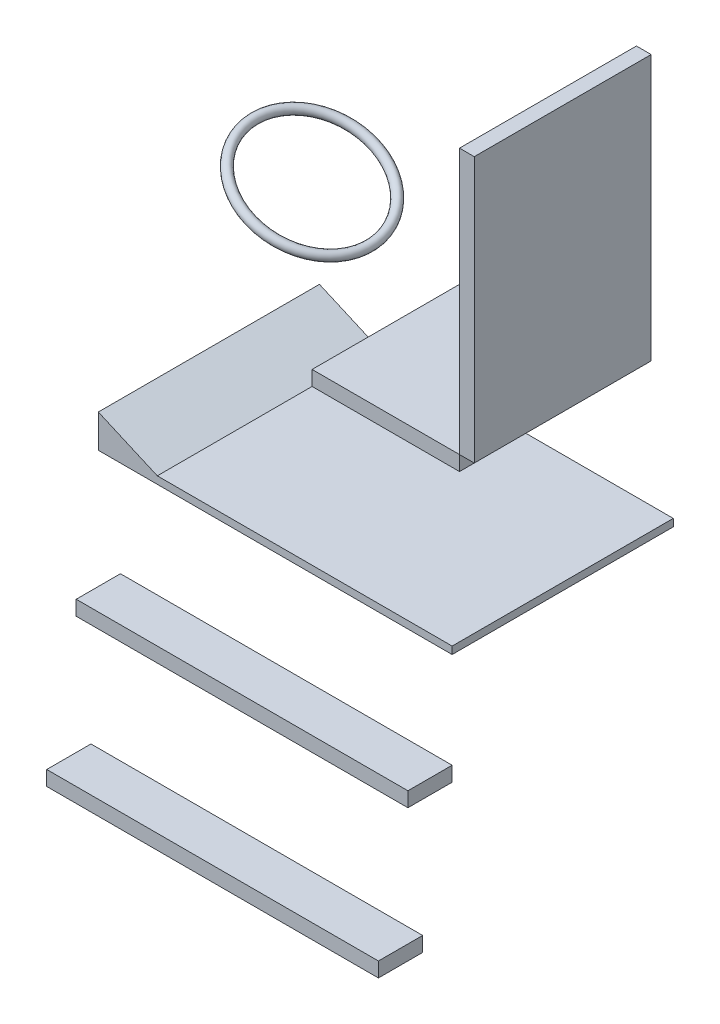
ISO-10303-21;
HEADER;
FILE_DESCRIPTION(('STEP AP214'),'2;1');
FILE_NAME('part.step','',(''),(''),'','','');
FILE_SCHEMA(('AUTOMOTIVE_DESIGN { 1 0 10303 214 1 1 1 1 }'));
ENDSEC;
DATA;
#1=APPLICATION_CONTEXT('core data for automotive mechanical design processes');
#2=APPLICATION_PROTOCOL_DEFINITION('international standard','automotive_design',2000,#1);
#3=PRODUCT_CONTEXT('',#1,'mechanical');
#4=PRODUCT('Part','Part','',(#3));
#5=PRODUCT_RELATED_PRODUCT_CATEGORY('part','',(#4));
#6=PRODUCT_DEFINITION_FORMATION('','',#4);
#7=PRODUCT_DEFINITION_CONTEXT('part definition',#1,'design');
#8=PRODUCT_DEFINITION('design','',#6,#7);
#9=PRODUCT_DEFINITION_SHAPE('','',#8);
#10=(LENGTH_UNIT() NAMED_UNIT(*) SI_UNIT(.MILLI.,.METRE.));
#11=(NAMED_UNIT(*) PLANE_ANGLE_UNIT() SI_UNIT($,.RADIAN.));
#12=(NAMED_UNIT(*) SI_UNIT($,.STERADIAN.) SOLID_ANGLE_UNIT());
#13=UNCERTAINTY_MEASURE_WITH_UNIT(LENGTH_MEASURE(1.E-05),#10,'distance_accuracy_value','');
#14=(GEOMETRIC_REPRESENTATION_CONTEXT(3) GLOBAL_UNCERTAINTY_ASSIGNED_CONTEXT((#13)) GLOBAL_UNIT_ASSIGNED_CONTEXT((#10,
#11,#12)) REPRESENTATION_CONTEXT('',''));
#15=CARTESIAN_POINT('',(0.,0.,0.));
#16=DIRECTION('',(0.,0.,1.));
#17=DIRECTION('',(1.,0.,0.));
#18=AXIS2_PLACEMENT_3D('',#15,#16,#17);
#19=CARTESIAN_POINT('',(355.375295826059,2032.10478127713,-381.));
#20=DIRECTION('',(-0.422618261740694,-0.906307787036653,0.));
#21=DIRECTION('',(0.906307787036653,-0.422618261740694,0.));
#22=AXIS2_PLACEMENT_3D('',#19,#20,#21);
#23=TOROIDAL_SURFACE('',#22,217.4875,15.875);
#24=CARTESIAN_POINT('',(158.264680992925,2124.01897047746,-381.));
#25=DIRECTION('',(0.,0.,1.));
#26=DIRECTION('',(1.,0.,0.));
#27=AXIS2_PLACEMENT_3D('',#24,#25,#26);
#28=CIRCLE('',#27,15.875);
#29=CARTESIAN_POINT('',(143.877044873718,2130.72803538259,-381.));
#30=VERTEX_POINT('',#29);
#31=EDGE_CURVE('E11',#30,#30,#28,.T.);
#32=CARTESIAN_POINT('',(355.375295826059,2032.10478127713,-381.));
#33=DIRECTION('',(-0.422618261740694,-0.906307787036653,0.));
#34=DIRECTION('',(0.906307787036653,-0.422618261740694,0.));
#35=AXIS2_PLACEMENT_3D('',#32,#33,#34);
#36=CIRCLE('',#35,233.3625);
#37=EDGE_CURVE('',#30,#30,#36,.T.);
#38=ORIENTED_EDGE('',*,*,#31,.F.);
#39=ORIENTED_EDGE('',*,*,#31,.T.);
#40=ORIENTED_EDGE('',*,*,#37,.T.);
#41=ORIENTED_EDGE('',*,*,#37,.F.);
#42=EDGE_LOOP('',(#38,#40,#39,#41));
#43=FACE_BOUND('',#42,.T.);
#44=ADVANCED_FACE('F54',(#43),#23,.T.);
#45=CLOSED_SHELL('',(#44));
#46=MANIFOLD_SOLID_BREP('B2',#45);
#47=CARTESIAN_POINT('',(0.,1244.6,0.));
#48=DIRECTION('',(1.,0.,0.));
#49=DIRECTION('',(0.,0.,-1.));
#50=AXIS2_PLACEMENT_3D('',#47,#48,#49);
#51=PLANE('',#50);
#52=DIRECTION('',(0.,0.,-1.));
#53=VECTOR('',#52,1.);
#54=CARTESIAN_POINT('',(0.,1358.9,0.));
#55=LINE('',#54,#53);
#56=CARTESIAN_POINT('',(0.,1358.9,0.));
#57=VERTEX_POINT('',#56);
#58=CARTESIAN_POINT('',(0.,1358.9,-762.));
#59=VERTEX_POINT('',#58);
#60=EDGE_CURVE('E147',#57,#59,#55,.T.);
#61=ORIENTED_EDGE('',*,*,#60,.T.);
#62=DIRECTION('',(0.,-1.,0.));
#63=VECTOR('',#62,1.);
#64=CARTESIAN_POINT('',(0.,1244.6,-762.));
#65=LINE('',#64,#63);
#66=CARTESIAN_POINT('',(0.,1244.6,-762.));
#67=VERTEX_POINT('',#66);
#68=EDGE_CURVE('E140',#59,#67,#65,.T.);
#69=ORIENTED_EDGE('',*,*,#68,.T.);
#70=DIRECTION('',(0.,0.,-1.));
#71=VECTOR('',#70,1.);
#72=CARTESIAN_POINT('',(0.,1244.6,0.));
#73=LINE('',#72,#71);
#74=CARTESIAN_POINT('',(0.,1244.6,0.));
#75=VERTEX_POINT('',#74);
#76=EDGE_CURVE('E52',#75,#67,#73,.T.);
#77=ORIENTED_EDGE('',*,*,#76,.F.);
#78=DIRECTION('',(0.,-1.,0.));
#79=VECTOR('',#78,1.);
#80=CARTESIAN_POINT('',(0.,1244.6,0.));
#81=LINE('',#80,#79);
#82=EDGE_CURVE('E160',#57,#75,#81,.T.);
#83=ORIENTED_EDGE('',*,*,#82,.F.);
#84=EDGE_LOOP('',(#61,#69,#77,#83));
#85=FACE_BOUND('',#84,.T.);
#86=ADVANCED_FACE('F81',(#85),#51,.F.);
#87=CARTESIAN_POINT('',(1219.2,1244.6,0.));
#88=DIRECTION('',(0.,1.,0.));
#89=DIRECTION('',(-1.,0.,0.));
#90=AXIS2_PLACEMENT_3D('',#87,#88,#89);
#91=PLANE('',#90);
#92=ORIENTED_EDGE('',*,*,#76,.T.);
#93=DIRECTION('',(1.,0.,0.));
#94=VECTOR('',#93,1.);
#95=CARTESIAN_POINT('',(1219.2,1244.6,-762.));
#96=LINE('',#95,#94);
#97=CARTESIAN_POINT('',(1219.2,1244.6,-762.));
#98=VERTEX_POINT('',#97);
#99=EDGE_CURVE('E130',#67,#98,#96,.T.);
#100=ORIENTED_EDGE('',*,*,#99,.T.);
#101=DIRECTION('',(0.,0.,-1.));
#102=VECTOR('',#101,1.);
#103=CARTESIAN_POINT('',(1219.2,1244.6,0.));
#104=LINE('',#103,#102);
#105=CARTESIAN_POINT('',(1219.2,1244.6,0.));
#106=VERTEX_POINT('',#105);
#107=EDGE_CURVE('E89',#106,#98,#104,.T.);
#108=ORIENTED_EDGE('',*,*,#107,.F.);
#109=DIRECTION('',(1.,0.,0.));
#110=VECTOR('',#109,1.);
#111=CARTESIAN_POINT('',(1219.2,1244.6,0.));
#112=LINE('',#111,#110);
#113=EDGE_CURVE('E131',#75,#106,#112,.T.);
#114=ORIENTED_EDGE('',*,*,#113,.F.);
#115=EDGE_LOOP('',(#92,#100,#108,#114));
#116=FACE_BOUND('',#115,.T.);
#117=ADVANCED_FACE('F128',(#116),#91,.F.);
#118=CARTESIAN_POINT('',(1219.2,1270.,0.));
#119=DIRECTION('',(-1.,0.,0.));
#120=DIRECTION('',(0.,0.,1.));
#121=AXIS2_PLACEMENT_3D('',#118,#119,#120);
#122=PLANE('',#121);
#123=ORIENTED_EDGE('',*,*,#107,.T.);
#124=DIRECTION('',(0.,1.,0.));
#125=VECTOR('',#124,1.);
#126=CARTESIAN_POINT('',(1219.2,1270.,-762.));
#127=LINE('',#126,#125);
#128=CARTESIAN_POINT('',(1219.2,1270.,-762.));
#129=VERTEX_POINT('',#128);
#130=EDGE_CURVE('E144',#98,#129,#127,.T.);
#131=ORIENTED_EDGE('',*,*,#130,.T.);
#132=DIRECTION('',(0.,0.,-1.));
#133=VECTOR('',#132,1.);
#134=CARTESIAN_POINT('',(1219.2,1270.,0.));
#135=LINE('',#134,#133);
#136=CARTESIAN_POINT('',(1219.2,1270.,0.));
#137=VERTEX_POINT('',#136);
#138=EDGE_CURVE('E177',#137,#129,#135,.T.);
#139=ORIENTED_EDGE('',*,*,#138,.F.);
#140=DIRECTION('',(0.,1.,0.));
#141=VECTOR('',#140,1.);
#142=CARTESIAN_POINT('',(1219.2,1270.,0.));
#143=LINE('',#142,#141);
#144=EDGE_CURVE('E165',#106,#137,#143,.T.);
#145=ORIENTED_EDGE('',*,*,#144,.F.);
#146=EDGE_LOOP('',(#123,#131,#139,#145));
#147=FACE_BOUND('',#146,.T.);
#148=ADVANCED_FACE('F182',(#147),#122,.F.);
#149=CARTESIAN_POINT('',(203.2,1270.,0.));
#150=DIRECTION('',(0.,-1.,0.));
#151=DIRECTION('',(0.,0.,-1.));
#152=AXIS2_PLACEMENT_3D('',#149,#150,#151);
#153=PLANE('',#152);
#154=ORIENTED_EDGE('',*,*,#138,.T.);
#155=DIRECTION('',(-1.,0.,0.));
#156=VECTOR('',#155,1.);
#157=CARTESIAN_POINT('',(203.2,1270.,-762.));
#158=LINE('',#157,#156);
#159=CARTESIAN_POINT('',(203.2,1270.,-762.));
#160=VERTEX_POINT('',#159);
#161=EDGE_CURVE('E153',#129,#160,#158,.T.);
#162=ORIENTED_EDGE('',*,*,#161,.T.);
#163=DIRECTION('',(0.,0.,-1.));
#164=VECTOR('',#163,1.);
#165=CARTESIAN_POINT('',(203.2,1270.,0.));
#166=LINE('',#165,#164);
#167=CARTESIAN_POINT('',(203.2,1270.,0.));
#168=VERTEX_POINT('',#167);
#169=EDGE_CURVE('E174',#168,#160,#166,.T.);
#170=ORIENTED_EDGE('',*,*,#169,.F.);
#171=DIRECTION('',(-1.,0.,0.));
#172=VECTOR('',#171,1.);
#173=CARTESIAN_POINT('',(203.2,1270.,0.));
#174=LINE('',#173,#172);
#175=EDGE_CURVE('E101',#137,#168,#174,.T.);
#176=ORIENTED_EDGE('',*,*,#175,.F.);
#177=EDGE_LOOP('',(#154,#162,#170,#176));
#178=FACE_BOUND('',#177,.T.);
#179=ADVANCED_FACE('F193',(#178),#153,.F.);
#180=CARTESIAN_POINT('',(0.,1358.9,0.));
#181=DIRECTION('',(-0.400818834019708,-0.916157334902189,0.));
#182=DIRECTION('',(0.916157334902189,-0.400818834019708,0.));
#183=AXIS2_PLACEMENT_3D('',#180,#181,#182);
#184=PLANE('',#183);
#185=ORIENTED_EDGE('',*,*,#169,.T.);
#186=DIRECTION('',(-0.916157334902189,0.400818834019708,0.));
#187=VECTOR('',#186,1.);
#188=CARTESIAN_POINT('',(0.,1358.9,-762.));
#189=LINE('',#188,#187);
#190=EDGE_CURVE('E157',#160,#59,#189,.T.);
#191=ORIENTED_EDGE('',*,*,#190,.T.);
#192=ORIENTED_EDGE('',*,*,#60,.F.);
#193=DIRECTION('',(-0.916157334902189,0.400818834019708,0.));
#194=VECTOR('',#193,1.);
#195=CARTESIAN_POINT('',(0.,1358.9,0.));
#196=LINE('',#195,#194);
#197=EDGE_CURVE('E96',#168,#57,#196,.T.);
#198=ORIENTED_EDGE('',*,*,#197,.F.);
#199=EDGE_LOOP('',(#185,#191,#192,#198));
#200=FACE_BOUND('',#199,.T.);
#201=ADVANCED_FACE('F186',(#200),#184,.F.);
#202=CARTESIAN_POINT('',(0.,0.,0.));
#203=DIRECTION('',(0.,0.,-1.));
#204=DIRECTION('',(-1.,0.,0.));
#205=AXIS2_PLACEMENT_3D('',#202,#203,#204);
#206=PLANE('',#205);
#207=ORIENTED_EDGE('',*,*,#82,.T.);
#208=ORIENTED_EDGE('',*,*,#113,.T.);
#209=ORIENTED_EDGE('',*,*,#144,.T.);
#210=ORIENTED_EDGE('',*,*,#175,.T.);
#211=ORIENTED_EDGE('',*,*,#197,.T.);
#212=EDGE_LOOP('',(#207,#208,#209,#210,#211));
#213=FACE_BOUND('',#212,.T.);
#214=ADVANCED_FACE('F184',(#213),#206,.F.);
#215=CARTESIAN_POINT('',(0.,0.,-762.));
#216=DIRECTION('',(0.,0.,-1.));
#217=DIRECTION('',(-1.,0.,0.));
#218=AXIS2_PLACEMENT_3D('',#215,#216,#217);
#219=PLANE('',#218);
#220=ORIENTED_EDGE('',*,*,#68,.F.);
#221=ORIENTED_EDGE('',*,*,#190,.F.);
#222=ORIENTED_EDGE('',*,*,#161,.F.);
#223=ORIENTED_EDGE('',*,*,#130,.F.);
#224=ORIENTED_EDGE('',*,*,#99,.F.);
#225=EDGE_LOOP('',(#220,#221,#222,#223,#224));
#226=FACE_BOUND('',#225,.T.);
#227=ADVANCED_FACE('F138',(#226),#219,.T.);
#228=CLOSED_SHELL('',(#86,#117,#148,#179,#201,#214,#227));
#229=MANIFOLD_SOLID_BREP('B6',#228);
#230=CARTESIAN_POINT('',(1219.2,2692.4,-76.2));
#231=DIRECTION('',(0.,-1.,0.));
#232=DIRECTION('',(0.,0.,-1.));
#233=AXIS2_PLACEMENT_3D('',#230,#231,#232);
#234=PLANE('',#233);
#235=DIRECTION('',(0.,0.,-1.));
#236=VECTOR('',#235,1.);
#237=CARTESIAN_POINT('',(1219.2,2692.4,-76.2));
#238=LINE('',#237,#236);
#239=CARTESIAN_POINT('',(1219.2,2692.4,-76.2));
#240=VERTEX_POINT('',#239);
#241=CARTESIAN_POINT('',(1219.2,2692.4,-685.8));
#242=VERTEX_POINT('',#241);
#243=EDGE_CURVE('E313',#240,#242,#238,.T.);
#244=ORIENTED_EDGE('',*,*,#243,.T.);
#245=DIRECTION('',(-1.,0.,0.));
#246=VECTOR('',#245,1.);
#247=CARTESIAN_POINT('',(1219.2,2692.4,-685.8));
#248=LINE('',#247,#246);
#249=CARTESIAN_POINT('',(1168.4,2692.4,-685.8));
#250=VERTEX_POINT('',#249);
#251=EDGE_CURVE('E308',#242,#250,#248,.T.);
#252=ORIENTED_EDGE('',*,*,#251,.T.);
#253=DIRECTION('',(0.,0.,-1.));
#254=VECTOR('',#253,1.);
#255=CARTESIAN_POINT('',(1168.4,2692.4,-76.2));
#256=LINE('',#255,#254);
#257=CARTESIAN_POINT('',(1168.4,2692.4,-76.2));
#258=VERTEX_POINT('',#257);
#259=EDGE_CURVE('E79',#258,#250,#256,.T.);
#260=ORIENTED_EDGE('',*,*,#259,.F.);
#261=DIRECTION('',(-1.,0.,0.));
#262=VECTOR('',#261,1.);
#263=CARTESIAN_POINT('',(1219.2,2692.4,-76.2));
#264=LINE('',#263,#262);
#265=EDGE_CURVE('E319',#240,#258,#264,.T.);
#266=ORIENTED_EDGE('',*,*,#265,.F.);
#267=EDGE_LOOP('',(#244,#252,#260,#266));
#268=FACE_BOUND('',#267,.T.);
#269=ADVANCED_FACE('F256',(#268),#234,.F.);
#270=CARTESIAN_POINT('',(1168.4,1778.,-76.2));
#271=DIRECTION('',(1.,0.,0.));
#272=DIRECTION('',(0.,0.,-1.));
#273=AXIS2_PLACEMENT_3D('',#270,#271,#272);
#274=PLANE('',#273);
#275=ORIENTED_EDGE('',*,*,#259,.T.);
#276=DIRECTION('',(0.,-1.,0.));
#277=VECTOR('',#276,1.);
#278=CARTESIAN_POINT('',(1168.4,1778.,-685.8));
#279=LINE('',#278,#277);
#280=CARTESIAN_POINT('',(1168.4,1778.,-685.8));
#281=VERTEX_POINT('',#280);
#282=EDGE_CURVE('E298',#250,#281,#279,.T.);
#283=ORIENTED_EDGE('',*,*,#282,.T.);
#284=DIRECTION('',(0.,0.,-1.));
#285=VECTOR('',#284,1.);
#286=CARTESIAN_POINT('',(1168.4,1778.,-76.2));
#287=LINE('',#286,#285);
#288=CARTESIAN_POINT('',(1168.4,1778.,-76.2));
#289=VERTEX_POINT('',#288);
#290=EDGE_CURVE('E263',#289,#281,#287,.T.);
#291=ORIENTED_EDGE('',*,*,#290,.F.);
#292=DIRECTION('',(0.,-1.,0.));
#293=VECTOR('',#292,1.);
#294=CARTESIAN_POINT('',(1168.4,1778.,-76.2));
#295=LINE('',#294,#293);
#296=EDGE_CURVE('E299',#258,#289,#295,.T.);
#297=ORIENTED_EDGE('',*,*,#296,.F.);
#298=EDGE_LOOP('',(#275,#283,#291,#297));
#299=FACE_BOUND('',#298,.T.);
#300=ADVANCED_FACE('F296',(#299),#274,.F.);
#301=CARTESIAN_POINT('',(1168.4,1778.,-76.2));
#302=DIRECTION('',(0.,1.,0.));
#303=DIRECTION('',(0.,0.,1.));
#304=AXIS2_PLACEMENT_3D('',#301,#302,#303);
#305=PLANE('',#304);
#306=ORIENTED_EDGE('',*,*,#290,.T.);
#307=DIRECTION('',(1.,0.,0.));
#308=VECTOR('',#307,1.);
#309=CARTESIAN_POINT('',(1168.4,1778.,-685.8));
#310=LINE('',#309,#308);
#311=CARTESIAN_POINT('',(1219.2,1778.,-685.8));
#312=VERTEX_POINT('',#311);
#313=EDGE_CURVE('E311',#281,#312,#310,.T.);
#314=ORIENTED_EDGE('',*,*,#313,.T.);
#315=DIRECTION('',(0.,0.,-1.));
#316=VECTOR('',#315,1.);
#317=CARTESIAN_POINT('',(1219.2,1778.,-76.2));
#318=LINE('',#317,#316);
#319=CARTESIAN_POINT('',(1219.2,1778.,-76.2));
#320=VERTEX_POINT('',#319);
#321=EDGE_CURVE('E325',#320,#312,#318,.T.);
#322=ORIENTED_EDGE('',*,*,#321,.F.);
#323=DIRECTION('',(1.,0.,0.));
#324=VECTOR('',#323,1.);
#325=CARTESIAN_POINT('',(1168.4,1778.,-76.2));
#326=LINE('',#325,#324);
#327=EDGE_CURVE('E275',#289,#320,#326,.T.);
#328=ORIENTED_EDGE('',*,*,#327,.F.);
#329=EDGE_LOOP('',(#306,#314,#322,#328));
#330=FACE_BOUND('',#329,.T.);
#331=ADVANCED_FACE('F327',(#330),#305,.F.);
#332=CARTESIAN_POINT('',(1219.2,1778.,-76.2));
#333=DIRECTION('',(-1.,0.,0.));
#334=DIRECTION('',(0.,-1.,0.));
#335=AXIS2_PLACEMENT_3D('',#332,#333,#334);
#336=PLANE('',#335);
#337=ORIENTED_EDGE('',*,*,#321,.T.);
#338=DIRECTION('',(0.,1.,0.));
#339=VECTOR('',#338,1.);
#340=CARTESIAN_POINT('',(1219.2,1778.,-685.8));
#341=LINE('',#340,#339);
#342=EDGE_CURVE('E317',#312,#242,#341,.T.);
#343=ORIENTED_EDGE('',*,*,#342,.T.);
#344=ORIENTED_EDGE('',*,*,#243,.F.);
#345=DIRECTION('',(0.,1.,0.));
#346=VECTOR('',#345,1.);
#347=CARTESIAN_POINT('',(1219.2,1778.,-76.2));
#348=LINE('',#347,#346);
#349=EDGE_CURVE('E270',#320,#240,#348,.T.);
#350=ORIENTED_EDGE('',*,*,#349,.F.);
#351=EDGE_LOOP('',(#337,#343,#344,#350));
#352=FACE_BOUND('',#351,.T.);
#353=ADVANCED_FACE('F329',(#352),#336,.F.);
#354=CARTESIAN_POINT('',(0.,0.,-76.2));
#355=DIRECTION('',(0.,0.,-1.));
#356=DIRECTION('',(-1.,0.,0.));
#357=AXIS2_PLACEMENT_3D('',#354,#355,#356);
#358=PLANE('',#357);
#359=ORIENTED_EDGE('',*,*,#265,.T.);
#360=ORIENTED_EDGE('',*,*,#296,.T.);
#361=ORIENTED_EDGE('',*,*,#327,.T.);
#362=ORIENTED_EDGE('',*,*,#349,.T.);
#363=EDGE_LOOP('',(#359,#360,#361,#362));
#364=FACE_BOUND('',#363,.T.);
#365=ADVANCED_FACE('F330',(#364),#358,.F.);
#366=CARTESIAN_POINT('',(0.,0.,-685.8));
#367=DIRECTION('',(0.,0.,-1.));
#368=DIRECTION('',(-1.,0.,0.));
#369=AXIS2_PLACEMENT_3D('',#366,#367,#368);
#370=PLANE('',#369);
#371=ORIENTED_EDGE('',*,*,#251,.F.);
#372=ORIENTED_EDGE('',*,*,#342,.F.);
#373=ORIENTED_EDGE('',*,*,#313,.F.);
#374=ORIENTED_EDGE('',*,*,#282,.F.);
#375=EDGE_LOOP('',(#371,#372,#373,#374));
#376=FACE_BOUND('',#375,.T.);
#377=ADVANCED_FACE('F306',(#376),#370,.T.);
#378=CLOSED_SHELL('',(#269,#300,#331,#353,#365,#377));
#379=MANIFOLD_SOLID_BREP('B46',#378);
#380=CARTESIAN_POINT('',(660.4,1727.2,-76.2000000000001));
#381=DIRECTION('',(0.,0.,1.));
#382=DIRECTION('',(1.,0.,0.));
#383=AXIS2_PLACEMENT_3D('',#380,#381,#382);
#384=PLANE('',#383);
#385=DIRECTION('',(1.,0.,0.));
#386=VECTOR('',#385,1.);
#387=CARTESIAN_POINT('',(660.4,1778.,-76.2000000000001));
#388=LINE('',#387,#386);
#389=CARTESIAN_POINT('',(660.4,1778.,-76.2000000000001));
#390=VERTEX_POINT('',#389);
#391=CARTESIAN_POINT('',(1168.4,1778.,-76.2000000000001));
#392=VERTEX_POINT('',#391);
#393=EDGE_CURVE('E454',#390,#392,#388,.T.);
#394=ORIENTED_EDGE('',*,*,#393,.F.);
#395=DIRECTION('',(0.,1.,0.));
#396=VECTOR('',#395,1.);
#397=CARTESIAN_POINT('',(660.4,1727.2,-76.2000000000001));
#398=LINE('',#397,#396);
#399=CARTESIAN_POINT('',(660.4,1727.2,-76.2000000000001));
#400=VERTEX_POINT('',#399);
#401=EDGE_CURVE('E254',#400,#390,#398,.T.);
#402=ORIENTED_EDGE('',*,*,#401,.F.);
#403=DIRECTION('',(1.,0.,0.));
#404=VECTOR('',#403,1.);
#405=CARTESIAN_POINT('',(660.4,1727.2,-76.2000000000001));
#406=LINE('',#405,#404);
#407=CARTESIAN_POINT('',(1168.4,1727.2,-76.2000000000001));
#408=VERTEX_POINT('',#407);
#409=EDGE_CURVE('E448',#400,#408,#406,.T.);
#410=ORIENTED_EDGE('',*,*,#409,.T.);
#411=DIRECTION('',(0.,1.,0.));
#412=VECTOR('',#411,1.);
#413=CARTESIAN_POINT('',(1168.4,1727.2,-76.2000000000001));
#414=LINE('',#413,#412);
#415=EDGE_CURVE('E393',#408,#392,#414,.T.);
#416=ORIENTED_EDGE('',*,*,#415,.T.);
#417=EDGE_LOOP('',(#394,#402,#410,#416));
#418=FACE_BOUND('',#417,.T.);
#419=ADVANCED_FACE('F390',(#418),#384,.T.);
#420=CARTESIAN_POINT('',(660.4,1727.2,-76.2000000000001));
#421=DIRECTION('',(-1.,0.,0.));
#422=DIRECTION('',(0.,0.,1.));
#423=AXIS2_PLACEMENT_3D('',#420,#421,#422);
#424=PLANE('',#423);
#425=DIRECTION('',(0.,0.,1.));
#426=VECTOR('',#425,1.);
#427=CARTESIAN_POINT('',(660.4,1778.,-76.2000000000001));
#428=LINE('',#427,#426);
#429=CARTESIAN_POINT('',(660.4,1778.,-685.8));
#430=VERTEX_POINT('',#429);
#431=EDGE_CURVE('E450',#430,#390,#428,.T.);
#432=ORIENTED_EDGE('',*,*,#431,.F.);
#433=DIRECTION('',(0.,1.,0.));
#434=VECTOR('',#433,1.);
#435=CARTESIAN_POINT('',(660.4,1727.2,-685.8));
#436=LINE('',#435,#434);
#437=CARTESIAN_POINT('',(660.4,1727.2,-685.8));
#438=VERTEX_POINT('',#437);
#439=EDGE_CURVE('E399',#438,#430,#436,.T.);
#440=ORIENTED_EDGE('',*,*,#439,.F.);
#441=DIRECTION('',(0.,0.,1.));
#442=VECTOR('',#441,1.);
#443=CARTESIAN_POINT('',(660.4,1727.2,-76.2000000000001));
#444=LINE('',#443,#442);
#445=EDGE_CURVE('E445',#438,#400,#444,.T.);
#446=ORIENTED_EDGE('',*,*,#445,.T.);
#447=ORIENTED_EDGE('',*,*,#401,.T.);
#448=EDGE_LOOP('',(#432,#440,#446,#447));
#449=FACE_BOUND('',#448,.T.);
#450=ADVANCED_FACE('F464',(#449),#424,.T.);
#451=CARTESIAN_POINT('',(660.4,1727.2,-685.8));
#452=DIRECTION('',(0.,0.,-1.));
#453=DIRECTION('',(-1.,0.,0.));
#454=AXIS2_PLACEMENT_3D('',#451,#452,#453);
#455=PLANE('',#454);
#456=DIRECTION('',(-1.,0.,0.));
#457=VECTOR('',#456,1.);
#458=CARTESIAN_POINT('',(660.4,1778.,-685.8));
#459=LINE('',#458,#457);
#460=CARTESIAN_POINT('',(1168.4,1778.,-685.8));
#461=VERTEX_POINT('',#460);
#462=EDGE_CURVE('E440',#461,#430,#459,.T.);
#463=ORIENTED_EDGE('',*,*,#462,.F.);
#464=DIRECTION('',(0.,1.,0.));
#465=VECTOR('',#464,1.);
#466=CARTESIAN_POINT('',(1168.4,1727.2,-685.8));
#467=LINE('',#466,#465);
#468=CARTESIAN_POINT('',(1168.4,1727.2,-685.8));
#469=VERTEX_POINT('',#468);
#470=EDGE_CURVE('E435',#469,#461,#467,.T.);
#471=ORIENTED_EDGE('',*,*,#470,.F.);
#472=DIRECTION('',(-1.,0.,0.));
#473=VECTOR('',#472,1.);
#474=CARTESIAN_POINT('',(660.4,1727.2,-685.8));
#475=LINE('',#474,#473);
#476=EDGE_CURVE('E438',#469,#438,#475,.T.);
#477=ORIENTED_EDGE('',*,*,#476,.T.);
#478=ORIENTED_EDGE('',*,*,#439,.T.);
#479=EDGE_LOOP('',(#463,#471,#477,#478));
#480=FACE_BOUND('',#479,.T.);
#481=ADVANCED_FACE('F437',(#480),#455,.T.);
#482=CARTESIAN_POINT('',(1168.4,1727.2,-76.2000000000001));
#483=DIRECTION('',(1.,0.,0.));
#484=DIRECTION('',(0.,0.,-1.));
#485=AXIS2_PLACEMENT_3D('',#482,#483,#484);
#486=PLANE('',#485);
#487=DIRECTION('',(0.,0.,-1.));
#488=VECTOR('',#487,1.);
#489=CARTESIAN_POINT('',(1168.4,1778.,-76.2000000000001));
#490=LINE('',#489,#488);
#491=EDGE_CURVE('E457',#392,#461,#490,.T.);
#492=ORIENTED_EDGE('',*,*,#491,.F.);
#493=ORIENTED_EDGE('',*,*,#415,.F.);
#494=DIRECTION('',(0.,0.,-1.));
#495=VECTOR('',#494,1.);
#496=CARTESIAN_POINT('',(1168.4,1727.2,-76.2000000000001));
#497=LINE('',#496,#495);
#498=EDGE_CURVE('E444',#408,#469,#497,.T.);
#499=ORIENTED_EDGE('',*,*,#498,.T.);
#500=ORIENTED_EDGE('',*,*,#470,.T.);
#501=EDGE_LOOP('',(#492,#493,#499,#500));
#502=FACE_BOUND('',#501,.T.);
#503=ADVANCED_FACE('F447',(#502),#486,.T.);
#504=CARTESIAN_POINT('',(0.,1727.2,0.));
#505=DIRECTION('',(0.,1.,0.));
#506=DIRECTION('',(0.,0.,1.));
#507=AXIS2_PLACEMENT_3D('',#504,#505,#506);
#508=PLANE('',#507);
#509=ORIENTED_EDGE('',*,*,#409,.F.);
#510=ORIENTED_EDGE('',*,*,#445,.F.);
#511=ORIENTED_EDGE('',*,*,#476,.F.);
#512=ORIENTED_EDGE('',*,*,#498,.F.);
#513=EDGE_LOOP('',(#509,#510,#511,#512));
#514=FACE_BOUND('',#513,.T.);
#515=ADVANCED_FACE('F443',(#514),#508,.F.);
#516=CARTESIAN_POINT('',(0.,1778.,0.));
#517=DIRECTION('',(0.,1.,0.));
#518=DIRECTION('',(0.,0.,1.));
#519=AXIS2_PLACEMENT_3D('',#516,#517,#518);
#520=PLANE('',#519);
#521=ORIENTED_EDGE('',*,*,#393,.T.);
#522=ORIENTED_EDGE('',*,*,#491,.T.);
#523=ORIENTED_EDGE('',*,*,#462,.T.);
#524=ORIENTED_EDGE('',*,*,#431,.T.);
#525=EDGE_LOOP('',(#521,#522,#523,#524));
#526=FACE_BOUND('',#525,.T.);
#527=ADVANCED_FACE('F463',(#526),#520,.T.);
#528=CLOSED_SHELL('',(#419,#450,#481,#503,#515,#527));
#529=MANIFOLD_SOLID_BREP('B73',#528);
#530=CARTESIAN_POINT('',(1219.2,406.4,101.6));
#531=DIRECTION('',(1.,0.,0.));
#532=DIRECTION('',(0.,0.,-1.));
#533=AXIS2_PLACEMENT_3D('',#530,#531,#532);
#534=PLANE('',#533);
#535=DIRECTION('',(0.,0.,-1.));
#536=VECTOR('',#535,1.);
#537=CARTESIAN_POINT('',(1219.2,457.2,101.6));
#538=LINE('',#537,#536);
#539=CARTESIAN_POINT('',(1219.2,457.2,254.));
#540=VERTEX_POINT('',#539);
#541=CARTESIAN_POINT('',(1219.2,457.2,101.6));
#542=VERTEX_POINT('',#541);
#543=EDGE_CURVE('E587',#540,#542,#538,.T.);
#544=ORIENTED_EDGE('',*,*,#543,.F.);
#545=DIRECTION('',(0.,1.,0.));
#546=VECTOR('',#545,1.);
#547=CARTESIAN_POINT('',(1219.2,406.4,254.));
#548=LINE('',#547,#546);
#549=CARTESIAN_POINT('',(1219.2,406.4,254.));
#550=VERTEX_POINT('',#549);
#551=EDGE_CURVE('E388',#550,#540,#548,.T.);
#552=ORIENTED_EDGE('',*,*,#551,.F.);
#553=DIRECTION('',(0.,0.,-1.));
#554=VECTOR('',#553,1.);
#555=CARTESIAN_POINT('',(1219.2,406.4,101.6));
#556=LINE('',#555,#554);
#557=CARTESIAN_POINT('',(1219.2,406.4,101.6));
#558=VERTEX_POINT('',#557);
#559=EDGE_CURVE('E581',#550,#558,#556,.T.);
#560=ORIENTED_EDGE('',*,*,#559,.T.);
#561=DIRECTION('',(0.,1.,0.));
#562=VECTOR('',#561,1.);
#563=CARTESIAN_POINT('',(1219.2,406.4,101.6));
#564=LINE('',#563,#562);
#565=EDGE_CURVE('E526',#558,#542,#564,.T.);
#566=ORIENTED_EDGE('',*,*,#565,.T.);
#567=EDGE_LOOP('',(#544,#552,#560,#566));
#568=FACE_BOUND('',#567,.T.);
#569=ADVANCED_FACE('F523',(#568),#534,.T.);
#570=CARTESIAN_POINT('',(1219.2,406.4,254.));
#571=DIRECTION('',(0.,0.,1.));
#572=DIRECTION('',(1.,0.,0.));
#573=AXIS2_PLACEMENT_3D('',#570,#571,#572);
#574=PLANE('',#573);
#575=DIRECTION('',(1.,0.,0.));
#576=VECTOR('',#575,1.);
#577=CARTESIAN_POINT('',(1219.2,457.2,254.));
#578=LINE('',#577,#576);
#579=CARTESIAN_POINT('',(76.2000000000001,457.2,254.));
#580=VERTEX_POINT('',#579);
#581=EDGE_CURVE('E583',#580,#540,#578,.T.);
#582=ORIENTED_EDGE('',*,*,#581,.F.);
#583=DIRECTION('',(0.,1.,0.));
#584=VECTOR('',#583,1.);
#585=CARTESIAN_POINT('',(76.2000000000001,406.4,254.));
#586=LINE('',#585,#584);
#587=CARTESIAN_POINT('',(76.2000000000001,406.4,254.));
#588=VERTEX_POINT('',#587);
#589=EDGE_CURVE('E532',#588,#580,#586,.T.);
#590=ORIENTED_EDGE('',*,*,#589,.F.);
#591=DIRECTION('',(1.,0.,0.));
#592=VECTOR('',#591,1.);
#593=CARTESIAN_POINT('',(1219.2,406.4,254.));
#594=LINE('',#593,#592);
#595=EDGE_CURVE('E578',#588,#550,#594,.T.);
#596=ORIENTED_EDGE('',*,*,#595,.T.);
#597=ORIENTED_EDGE('',*,*,#551,.T.);
#598=EDGE_LOOP('',(#582,#590,#596,#597));
#599=FACE_BOUND('',#598,.T.);
#600=ADVANCED_FACE('F597',(#599),#574,.T.);
#601=CARTESIAN_POINT('',(76.2,406.4,101.6));
#602=DIRECTION('',(-1.,0.,0.));
#603=DIRECTION('',(0.,0.,1.));
#604=AXIS2_PLACEMENT_3D('',#601,#602,#603);
#605=PLANE('',#604);
#606=DIRECTION('',(0.,0.,1.));
#607=VECTOR('',#606,1.);
#608=CARTESIAN_POINT('',(76.2,457.2,101.6));
#609=LINE('',#608,#607);
#610=CARTESIAN_POINT('',(76.2,457.2,101.6));
#611=VERTEX_POINT('',#610);
#612=EDGE_CURVE('E573',#611,#580,#609,.T.);
#613=ORIENTED_EDGE('',*,*,#612,.F.);
#614=DIRECTION('',(0.,1.,0.));
#615=VECTOR('',#614,1.);
#616=CARTESIAN_POINT('',(76.2,406.4,101.6));
#617=LINE('',#616,#615);
#618=CARTESIAN_POINT('',(76.2,406.4,101.6));
#619=VERTEX_POINT('',#618);
#620=EDGE_CURVE('E568',#619,#611,#617,.T.);
#621=ORIENTED_EDGE('',*,*,#620,.F.);
#622=DIRECTION('',(0.,0.,1.));
#623=VECTOR('',#622,1.);
#624=CARTESIAN_POINT('',(76.2,406.4,101.6));
#625=LINE('',#624,#623);
#626=EDGE_CURVE('E571',#619,#588,#625,.T.);
#627=ORIENTED_EDGE('',*,*,#626,.T.);
#628=ORIENTED_EDGE('',*,*,#589,.T.);
#629=EDGE_LOOP('',(#613,#621,#627,#628));
#630=FACE_BOUND('',#629,.T.);
#631=ADVANCED_FACE('F570',(#630),#605,.T.);
#632=CARTESIAN_POINT('',(1219.2,406.4,101.6));
#633=DIRECTION('',(0.,0.,-1.));
#634=DIRECTION('',(-1.,0.,0.));
#635=AXIS2_PLACEMENT_3D('',#632,#633,#634);
#636=PLANE('',#635);
#637=DIRECTION('',(-1.,0.,0.));
#638=VECTOR('',#637,1.);
#639=CARTESIAN_POINT('',(1219.2,457.2,101.6));
#640=LINE('',#639,#638);
#641=EDGE_CURVE('E590',#542,#611,#640,.T.);
#642=ORIENTED_EDGE('',*,*,#641,.F.);
#643=ORIENTED_EDGE('',*,*,#565,.F.);
#644=DIRECTION('',(-1.,0.,0.));
#645=VECTOR('',#644,1.);
#646=CARTESIAN_POINT('',(1219.2,406.4,101.6));
#647=LINE('',#646,#645);
#648=EDGE_CURVE('E577',#558,#619,#647,.T.);
#649=ORIENTED_EDGE('',*,*,#648,.T.);
#650=ORIENTED_EDGE('',*,*,#620,.T.);
#651=EDGE_LOOP('',(#642,#643,#649,#650));
#652=FACE_BOUND('',#651,.T.);
#653=ADVANCED_FACE('F580',(#652),#636,.T.);
#654=CARTESIAN_POINT('',(0.,406.4,0.));
#655=DIRECTION('',(0.,-1.,0.));
#656=DIRECTION('',(0.,0.,-1.));
#657=AXIS2_PLACEMENT_3D('',#654,#655,#656);
#658=PLANE('',#657);
#659=ORIENTED_EDGE('',*,*,#559,.F.);
#660=ORIENTED_EDGE('',*,*,#595,.F.);
#661=ORIENTED_EDGE('',*,*,#626,.F.);
#662=ORIENTED_EDGE('',*,*,#648,.F.);
#663=EDGE_LOOP('',(#659,#660,#661,#662));
#664=FACE_BOUND('',#663,.T.);
#665=ADVANCED_FACE('F576',(#664),#658,.T.);
#666=CARTESIAN_POINT('',(0.,457.2,0.));
#667=DIRECTION('',(0.,-1.,0.));
#668=DIRECTION('',(0.,0.,-1.));
#669=AXIS2_PLACEMENT_3D('',#666,#667,#668);
#670=PLANE('',#669);
#671=ORIENTED_EDGE('',*,*,#543,.T.);
#672=ORIENTED_EDGE('',*,*,#641,.T.);
#673=ORIENTED_EDGE('',*,*,#612,.T.);
#674=ORIENTED_EDGE('',*,*,#581,.T.);
#675=EDGE_LOOP('',(#671,#672,#673,#674));
#676=FACE_BOUND('',#675,.T.);
#677=ADVANCED_FACE('F596',(#676),#670,.F.);
#678=CLOSED_SHELL('',(#569,#600,#631,#653,#665,#677));
#679=MANIFOLD_SOLID_BREP('B248',#678);
#680=CARTESIAN_POINT('',(76.2,863.6,152.4));
#681=DIRECTION('',(-1.,0.,0.));
#682=DIRECTION('',(0.,0.,1.));
#683=AXIS2_PLACEMENT_3D('',#680,#681,#682);
#684=PLANE('',#683);
#685=DIRECTION('',(0.,0.,1.));
#686=VECTOR('',#685,1.);
#687=CARTESIAN_POINT('',(76.2,914.4,152.4));
#688=LINE('',#687,#686);
#689=CARTESIAN_POINT('',(76.2,914.4,0.));
#690=VERTEX_POINT('',#689);
#691=CARTESIAN_POINT('',(76.2,914.4,152.4));
#692=VERTEX_POINT('',#691);
#693=EDGE_CURVE('E711',#690,#692,#688,.T.);
#694=ORIENTED_EDGE('',*,*,#693,.F.);
#695=DIRECTION('',(0.,1.,0.));
#696=VECTOR('',#695,1.);
#697=CARTESIAN_POINT('',(76.2,863.6,0.));
#698=LINE('',#697,#696);
#699=CARTESIAN_POINT('',(76.2,863.6,0.));
#700=VERTEX_POINT('',#699);
#701=EDGE_CURVE('E521',#700,#690,#698,.T.);
#702=ORIENTED_EDGE('',*,*,#701,.F.);
#703=DIRECTION('',(0.,0.,1.));
#704=VECTOR('',#703,1.);
#705=CARTESIAN_POINT('',(76.2,863.6,152.4));
#706=LINE('',#705,#704);
#707=CARTESIAN_POINT('',(76.2,863.6,152.4));
#708=VERTEX_POINT('',#707);
#709=EDGE_CURVE('E705',#700,#708,#706,.T.);
#710=ORIENTED_EDGE('',*,*,#709,.T.);
#711=DIRECTION('',(0.,1.,0.));
#712=VECTOR('',#711,1.);
#713=CARTESIAN_POINT('',(76.2,863.6,152.4));
#714=LINE('',#713,#712);
#715=EDGE_CURVE('E650',#708,#692,#714,.T.);
#716=ORIENTED_EDGE('',*,*,#715,.T.);
#717=EDGE_LOOP('',(#694,#702,#710,#716));
#718=FACE_BOUND('',#717,.T.);
#719=ADVANCED_FACE('F647',(#718),#684,.T.);
#720=CARTESIAN_POINT('',(76.2,863.6,0.));
#721=DIRECTION('',(0.,0.,-1.));
#722=DIRECTION('',(-1.,0.,0.));
#723=AXIS2_PLACEMENT_3D('',#720,#721,#722);
#724=PLANE('',#723);
#725=DIRECTION('',(-1.,0.,0.));
#726=VECTOR('',#725,1.);
#727=CARTESIAN_POINT('',(76.2,914.4,0.));
#728=LINE('',#727,#726);
#729=CARTESIAN_POINT('',(1219.2,914.4,0.));
#730=VERTEX_POINT('',#729);
#731=EDGE_CURVE('E707',#730,#690,#728,.T.);
#732=ORIENTED_EDGE('',*,*,#731,.F.);
#733=DIRECTION('',(0.,1.,0.));
#734=VECTOR('',#733,1.);
#735=CARTESIAN_POINT('',(1219.2,863.6,0.));
#736=LINE('',#735,#734);
#737=CARTESIAN_POINT('',(1219.2,863.6,0.));
#738=VERTEX_POINT('',#737);
#739=EDGE_CURVE('E656',#738,#730,#736,.T.);
#740=ORIENTED_EDGE('',*,*,#739,.F.);
#741=DIRECTION('',(-1.,0.,0.));
#742=VECTOR('',#741,1.);
#743=CARTESIAN_POINT('',(76.2,863.6,0.));
#744=LINE('',#743,#742);
#745=EDGE_CURVE('E702',#738,#700,#744,.T.);
#746=ORIENTED_EDGE('',*,*,#745,.T.);
#747=ORIENTED_EDGE('',*,*,#701,.T.);
#748=EDGE_LOOP('',(#732,#740,#746,#747));
#749=FACE_BOUND('',#748,.T.);
#750=ADVANCED_FACE('F721',(#749),#724,.T.);
#751=CARTESIAN_POINT('',(1219.2,863.6,152.4));
#752=DIRECTION('',(1.,0.,0.));
#753=DIRECTION('',(0.,0.,-1.));
#754=AXIS2_PLACEMENT_3D('',#751,#752,#753);
#755=PLANE('',#754);
#756=DIRECTION('',(0.,0.,-1.));
#757=VECTOR('',#756,1.);
#758=CARTESIAN_POINT('',(1219.2,914.4,152.4));
#759=LINE('',#758,#757);
#760=CARTESIAN_POINT('',(1219.2,914.4,152.4));
#761=VERTEX_POINT('',#760);
#762=EDGE_CURVE('E697',#761,#730,#759,.T.);
#763=ORIENTED_EDGE('',*,*,#762,.F.);
#764=DIRECTION('',(0.,1.,0.));
#765=VECTOR('',#764,1.);
#766=CARTESIAN_POINT('',(1219.2,863.6,152.4));
#767=LINE('',#766,#765);
#768=CARTESIAN_POINT('',(1219.2,863.6,152.4));
#769=VERTEX_POINT('',#768);
#770=EDGE_CURVE('E692',#769,#761,#767,.T.);
#771=ORIENTED_EDGE('',*,*,#770,.F.);
#772=DIRECTION('',(0.,0.,-1.));
#773=VECTOR('',#772,1.);
#774=CARTESIAN_POINT('',(1219.2,863.6,152.4));
#775=LINE('',#774,#773);
#776=EDGE_CURVE('E695',#769,#738,#775,.T.);
#777=ORIENTED_EDGE('',*,*,#776,.T.);
#778=ORIENTED_EDGE('',*,*,#739,.T.);
#779=EDGE_LOOP('',(#763,#771,#777,#778));
#780=FACE_BOUND('',#779,.T.);
#781=ADVANCED_FACE('F694',(#780),#755,.T.);
#782=CARTESIAN_POINT('',(76.2,863.6,152.4));
#783=DIRECTION('',(0.,0.,1.));
#784=DIRECTION('',(1.,0.,0.));
#785=AXIS2_PLACEMENT_3D('',#782,#783,#784);
#786=PLANE('',#785);
#787=DIRECTION('',(1.,0.,0.));
#788=VECTOR('',#787,1.);
#789=CARTESIAN_POINT('',(76.2,914.4,152.4));
#790=LINE('',#789,#788);
#791=EDGE_CURVE('E714',#692,#761,#790,.T.);
#792=ORIENTED_EDGE('',*,*,#791,.F.);
#793=ORIENTED_EDGE('',*,*,#715,.F.);
#794=DIRECTION('',(1.,0.,0.));
#795=VECTOR('',#794,1.);
#796=CARTESIAN_POINT('',(76.2,863.6,152.4));
#797=LINE('',#796,#795);
#798=EDGE_CURVE('E701',#708,#769,#797,.T.);
#799=ORIENTED_EDGE('',*,*,#798,.T.);
#800=ORIENTED_EDGE('',*,*,#770,.T.);
#801=EDGE_LOOP('',(#792,#793,#799,#800));
#802=FACE_BOUND('',#801,.T.);
#803=ADVANCED_FACE('F704',(#802),#786,.T.);
#804=CARTESIAN_POINT('',(0.,863.6,0.));
#805=DIRECTION('',(0.,-1.,0.));
#806=DIRECTION('',(0.,0.,-1.));
#807=AXIS2_PLACEMENT_3D('',#804,#805,#806);
#808=PLANE('',#807);
#809=ORIENTED_EDGE('',*,*,#709,.F.);
#810=ORIENTED_EDGE('',*,*,#745,.F.);
#811=ORIENTED_EDGE('',*,*,#776,.F.);
#812=ORIENTED_EDGE('',*,*,#798,.F.);
#813=EDGE_LOOP('',(#809,#810,#811,#812));
#814=FACE_BOUND('',#813,.T.);
#815=ADVANCED_FACE('F700',(#814),#808,.T.);
#816=CARTESIAN_POINT('',(0.,914.4,0.));
#817=DIRECTION('',(0.,-1.,0.));
#818=DIRECTION('',(0.,0.,-1.));
#819=AXIS2_PLACEMENT_3D('',#816,#817,#818);
#820=PLANE('',#819);
#821=ORIENTED_EDGE('',*,*,#693,.T.);
#822=ORIENTED_EDGE('',*,*,#791,.T.);
#823=ORIENTED_EDGE('',*,*,#762,.T.);
#824=ORIENTED_EDGE('',*,*,#731,.T.);
#825=EDGE_LOOP('',(#821,#822,#823,#824));
#826=FACE_BOUND('',#825,.T.);
#827=ADVANCED_FACE('F720',(#826),#820,.F.);
#828=CLOSED_SHELL('',(#719,#750,#781,#803,#815,#827));
#829=MANIFOLD_SOLID_BREP('B382',#828);
#830=ADVANCED_BREP_SHAPE_REPRESENTATION('',(#18,#46,#229,#379,#529,#679,#829),#14);
#831=SHAPE_DEFINITION_REPRESENTATION(#9,#830);
ENDSEC;
END-ISO-10303-21;
